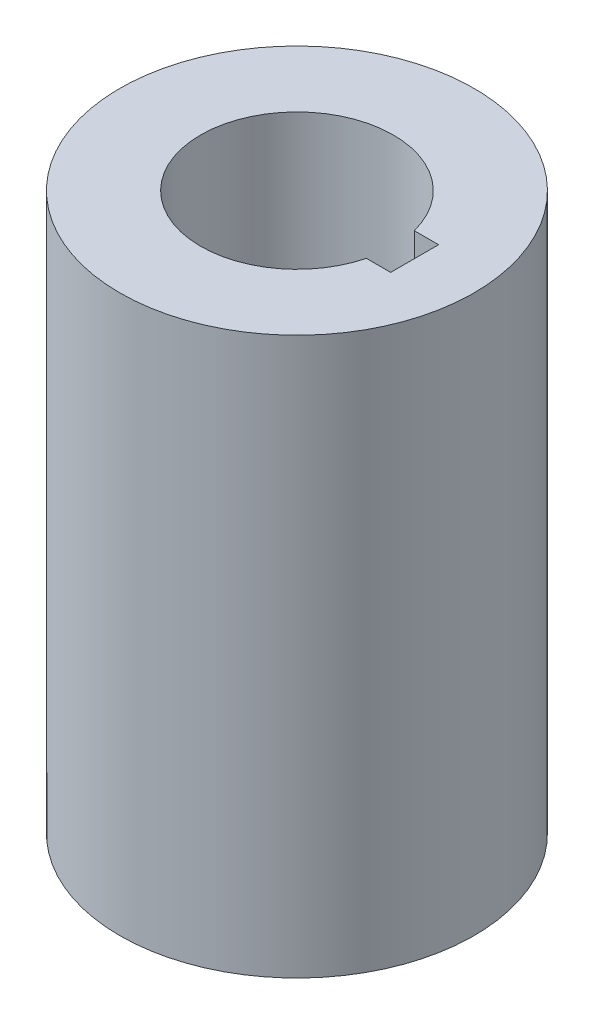
ISO-10303-21;
HEADER;
FILE_DESCRIPTION(('STEP AP214'),'2;1');
FILE_NAME('part.step','',(''),(''),'','','');
FILE_SCHEMA(('AUTOMOTIVE_DESIGN { 1 0 10303 214 1 1 1 1 }'));
ENDSEC;
DATA;
#1=APPLICATION_CONTEXT('core data for automotive mechanical design processes');
#2=APPLICATION_PROTOCOL_DEFINITION('international standard','automotive_design',2000,#1);
#3=PRODUCT_CONTEXT('',#1,'mechanical');
#4=PRODUCT('Part','Part','',(#3));
#5=PRODUCT_RELATED_PRODUCT_CATEGORY('part','',(#4));
#6=PRODUCT_DEFINITION_FORMATION('','',#4);
#7=PRODUCT_DEFINITION_CONTEXT('part definition',#1,'design');
#8=PRODUCT_DEFINITION('design','',#6,#7);
#9=PRODUCT_DEFINITION_SHAPE('','',#8);
#10=(LENGTH_UNIT() NAMED_UNIT(*) SI_UNIT(.MILLI.,.METRE.));
#11=(NAMED_UNIT(*) PLANE_ANGLE_UNIT() SI_UNIT($,.RADIAN.));
#12=(NAMED_UNIT(*) SI_UNIT($,.STERADIAN.) SOLID_ANGLE_UNIT());
#13=UNCERTAINTY_MEASURE_WITH_UNIT(LENGTH_MEASURE(1.E-05),#10,'distance_accuracy_value','');
#14=(GEOMETRIC_REPRESENTATION_CONTEXT(3) GLOBAL_UNCERTAINTY_ASSIGNED_CONTEXT((#13)) GLOBAL_UNIT_ASSIGNED_CONTEXT((#10,
#11,#12)) REPRESENTATION_CONTEXT('',''));
#15=CARTESIAN_POINT('',(0.,0.,0.));
#16=DIRECTION('',(0.,0.,1.));
#17=DIRECTION('',(1.,0.,0.));
#18=AXIS2_PLACEMENT_3D('',#15,#16,#17);
#19=CARTESIAN_POINT('',(0.,55.,0.));
#20=DIRECTION('',(0.,1.,0.));
#21=DIRECTION('',(0.,0.,1.));
#22=AXIS2_PLACEMENT_3D('',#19,#20,#21);
#23=PLANE('',#22);
#24=CARTESIAN_POINT('',(0.,55.,0.));
#25=DIRECTION('',(0.,1.,0.));
#26=DIRECTION('',(0.,0.,1.));
#27=AXIS2_PLACEMENT_3D('',#24,#25,#26);
#28=CIRCLE('',#27,17.5);
#29=CARTESIAN_POINT('',(0.,55.,17.5));
#30=VERTEX_POINT('',#29);
#31=EDGE_CURVE('E11',#30,#30,#28,.T.);
#32=ORIENTED_EDGE('',*,*,#31,.T.);
#33=EDGE_LOOP('',(#32));
#34=FACE_BOUND('',#33,.T.);
#35=DIRECTION('',(0.,0.,-1.));
#36=VECTOR('',#35,1.);
#37=CARTESIAN_POINT('',(11.625,55.,2.36692429520247));
#38=LINE('',#37,#36);
#39=CARTESIAN_POINT('',(11.625,55.,2.36692429520247));
#40=VERTEX_POINT('',#39);
#41=CARTESIAN_POINT('',(11.625,55.,-2.37));
#42=VERTEX_POINT('',#41);
#43=EDGE_CURVE('E107',#40,#42,#38,.T.);
#44=ORIENTED_EDGE('',*,*,#43,.F.);
#45=DIRECTION('',(1.,0.,0.));
#46=VECTOR('',#45,1.);
#47=CARTESIAN_POINT('',(6.895,55.,2.36692429520247));
#48=LINE('',#47,#46);
#49=CARTESIAN_POINT('',(9.22622861091033,55.,2.36692429520247));
#50=VERTEX_POINT('',#49);
#51=EDGE_CURVE('E96',#50,#40,#48,.T.);
#52=ORIENTED_EDGE('',*,*,#51,.F.);
#53=CARTESIAN_POINT('',(0.,55.,0.));
#54=DIRECTION('',(0.,1.,0.));
#55=DIRECTION('',(0.,0.,1.));
#56=AXIS2_PLACEMENT_3D('',#53,#54,#55);
#57=CIRCLE('',#56,9.525);
#58=CARTESIAN_POINT('',(9.225439013944,55.,-2.37));
#59=VERTEX_POINT('',#58);
#60=EDGE_CURVE('E105',#59,#50,#57,.T.);
#61=ORIENTED_EDGE('',*,*,#60,.F.);
#62=DIRECTION('',(-1.,0.,0.));
#63=VECTOR('',#62,1.);
#64=CARTESIAN_POINT('',(9.525,55.,-2.37));
#65=LINE('',#64,#63);
#66=EDGE_CURVE('E116',#42,#59,#65,.T.);
#67=ORIENTED_EDGE('',*,*,#66,.F.);
#68=EDGE_LOOP('',(#44,#52,#61,#67));
#69=FACE_BOUND('',#68,.T.);
#70=ADVANCED_FACE('F44',(#34,#69),#23,.T.);
#71=CARTESIAN_POINT('',(0.,32.,0.));
#72=DIRECTION('',(0.,1.,0.));
#73=DIRECTION('',(0.,0.,1.));
#74=AXIS2_PLACEMENT_3D('',#71,#72,#73);
#75=CYLINDRICAL_SURFACE('',#74,9.525);
#76=DIRECTION('',(0.,1.,0.));
#77=VECTOR('',#76,1.);
#78=CARTESIAN_POINT('',(9.22622861091033,32.,2.36692429520247));
#79=LINE('',#78,#77);
#80=CARTESIAN_POINT('',(9.22622861091033,32.,2.36692429520247));
#81=VERTEX_POINT('',#80);
#82=EDGE_CURVE('E90',#50,#81,#79,.F.);
#83=ORIENTED_EDGE('',*,*,#82,.T.);
#84=CARTESIAN_POINT('',(0.,32.,0.));
#85=DIRECTION('',(0.,1.,0.));
#86=DIRECTION('',(0.,0.,1.));
#87=AXIS2_PLACEMENT_3D('',#84,#85,#86);
#88=CIRCLE('',#87,9.525);
#89=CARTESIAN_POINT('',(9.225439013944,32.,-2.37));
#90=VERTEX_POINT('',#89);
#91=EDGE_CURVE('E103',#90,#81,#88,.T.);
#92=ORIENTED_EDGE('',*,*,#91,.F.);
#93=DIRECTION('',(0.,1.,0.));
#94=VECTOR('',#93,1.);
#95=CARTESIAN_POINT('',(9.225439013944,32.,-2.37));
#96=LINE('',#95,#94);
#97=EDGE_CURVE('E108',#90,#59,#96,.T.);
#98=ORIENTED_EDGE('',*,*,#97,.T.);
#99=ORIENTED_EDGE('',*,*,#60,.T.);
#100=EDGE_LOOP('',(#83,#92,#98,#99));
#101=FACE_BOUND('',#100,.T.);
#102=ADVANCED_FACE('F101',(#101),#75,.F.);
#103=CARTESIAN_POINT('',(0.,55.,0.));
#104=DIRECTION('',(0.,-1.,0.));
#105=DIRECTION('',(0.,0.,-1.));
#106=AXIS2_PLACEMENT_3D('',#103,#104,#105);
#107=CYLINDRICAL_SURFACE('',#106,17.5);
#108=ORIENTED_EDGE('',*,*,#31,.F.);
#109=EDGE_LOOP('',(#108));
#110=FACE_BOUND('',#109,.T.);
#111=CARTESIAN_POINT('',(0.,0.,0.));
#112=DIRECTION('',(0.,1.,0.));
#113=DIRECTION('',(0.,0.,1.));
#114=AXIS2_PLACEMENT_3D('',#111,#112,#113);
#115=CIRCLE('',#114,17.5);
#116=CARTESIAN_POINT('',(0.,0.,17.5));
#117=VERTEX_POINT('',#116);
#118=EDGE_CURVE('E48',#117,#117,#115,.T.);
#119=ORIENTED_EDGE('',*,*,#118,.T.);
#120=EDGE_LOOP('',(#119));
#121=FACE_BOUND('',#120,.T.);
#122=ADVANCED_FACE('F46',(#110,#121),#107,.T.);
#123=CARTESIAN_POINT('',(0.,0.,0.));
#124=DIRECTION('',(0.,1.,0.));
#125=DIRECTION('',(0.,0.,1.));
#126=AXIS2_PLACEMENT_3D('',#123,#124,#125);
#127=PLANE('',#126);
#128=CARTESIAN_POINT('',(0.,0.,0.));
#129=DIRECTION('',(0.,-1.,0.));
#130=DIRECTION('',(0.,0.,-1.));
#131=AXIS2_PLACEMENT_3D('',#128,#129,#130);
#132=CIRCLE('',#131,6.);
#133=CARTESIAN_POINT('',(0.,0.,-6.));
#134=VERTEX_POINT('',#133);
#135=EDGE_CURVE('E136',#134,#134,#132,.T.);
#136=ORIENTED_EDGE('',*,*,#135,.F.);
#137=EDGE_LOOP('',(#136));
#138=FACE_BOUND('',#137,.T.);
#139=ORIENTED_EDGE('',*,*,#118,.F.);
#140=EDGE_LOOP('',(#139));
#141=FACE_BOUND('',#140,.T.);
#142=ADVANCED_FACE('F153',(#138,#141),#127,.F.);
#143=CARTESIAN_POINT('',(0.,32.,0.));
#144=DIRECTION('',(0.,1.,0.));
#145=DIRECTION('',(0.,0.,1.));
#146=AXIS2_PLACEMENT_3D('',#143,#144,#145);
#147=PLANE('',#146);
#148=ORIENTED_EDGE('',*,*,#91,.T.);
#149=DIRECTION('',(1.,0.,0.));
#150=VECTOR('',#149,1.);
#151=CARTESIAN_POINT('',(6.895,32.,2.36692429520247));
#152=LINE('',#151,#150);
#153=CARTESIAN_POINT('',(11.625,32.,2.36692429520247));
#154=VERTEX_POINT('',#153);
#155=EDGE_CURVE('E87',#81,#154,#152,.T.);
#156=ORIENTED_EDGE('',*,*,#155,.T.);
#157=DIRECTION('',(0.,0.,-1.));
#158=VECTOR('',#157,1.);
#159=CARTESIAN_POINT('',(11.625,32.,2.36692429520247));
#160=LINE('',#159,#158);
#161=CARTESIAN_POINT('',(11.625,32.,-2.37));
#162=VERTEX_POINT('',#161);
#163=EDGE_CURVE('E95',#154,#162,#160,.T.);
#164=ORIENTED_EDGE('',*,*,#163,.T.);
#165=DIRECTION('',(-1.,0.,0.));
#166=VECTOR('',#165,1.);
#167=CARTESIAN_POINT('',(9.525,32.,-2.37));
#168=LINE('',#167,#166);
#169=EDGE_CURVE('E60',#162,#90,#168,.T.);
#170=ORIENTED_EDGE('',*,*,#169,.T.);
#171=EDGE_LOOP('',(#148,#156,#164,#170));
#172=FACE_BOUND('',#171,.T.);
#173=ADVANCED_FACE('F110',(#172),#147,.T.);
#174=CARTESIAN_POINT('',(6.895,55.001,2.36692429520247));
#175=DIRECTION('',(0.,0.,-1.));
#176=DIRECTION('',(-1.,0.,0.));
#177=AXIS2_PLACEMENT_3D('',#174,#175,#176);
#178=PLANE('',#177);
#179=ORIENTED_EDGE('',*,*,#51,.T.);
#180=DIRECTION('',(0.,-1.,0.));
#181=VECTOR('',#180,1.);
#182=CARTESIAN_POINT('',(11.625,55.001,2.36692429520247));
#183=LINE('',#182,#181);
#184=EDGE_CURVE('E93',#40,#154,#183,.T.);
#185=ORIENTED_EDGE('',*,*,#184,.T.);
#186=ORIENTED_EDGE('',*,*,#155,.F.);
#187=ORIENTED_EDGE('',*,*,#82,.F.);
#188=EDGE_LOOP('',(#179,#185,#186,#187));
#189=FACE_BOUND('',#188,.T.);
#190=ADVANCED_FACE('F89',(#189),#178,.T.);
#191=CARTESIAN_POINT('',(11.625,55.001,2.36692429520247));
#192=DIRECTION('',(-1.,0.,0.));
#193=DIRECTION('',(0.,0.,1.));
#194=AXIS2_PLACEMENT_3D('',#191,#192,#193);
#195=PLANE('',#194);
#196=ORIENTED_EDGE('',*,*,#43,.T.);
#197=DIRECTION('',(0.,-1.,0.));
#198=VECTOR('',#197,1.);
#199=CARTESIAN_POINT('',(11.625,55.001,-2.37));
#200=LINE('',#199,#198);
#201=EDGE_CURVE('E68',#42,#162,#200,.T.);
#202=ORIENTED_EDGE('',*,*,#201,.T.);
#203=ORIENTED_EDGE('',*,*,#163,.F.);
#204=ORIENTED_EDGE('',*,*,#184,.F.);
#205=EDGE_LOOP('',(#196,#202,#203,#204));
#206=FACE_BOUND('',#205,.T.);
#207=ADVANCED_FACE('F176',(#206),#195,.T.);
#208=CARTESIAN_POINT('',(9.525,55.001,-2.37));
#209=DIRECTION('',(0.,0.,1.));
#210=DIRECTION('',(1.,0.,0.));
#211=AXIS2_PLACEMENT_3D('',#208,#209,#210);
#212=PLANE('',#211);
#213=ORIENTED_EDGE('',*,*,#66,.T.);
#214=ORIENTED_EDGE('',*,*,#97,.F.);
#215=ORIENTED_EDGE('',*,*,#169,.F.);
#216=ORIENTED_EDGE('',*,*,#201,.F.);
#217=EDGE_LOOP('',(#213,#214,#215,#216));
#218=FACE_BOUND('',#217,.T.);
#219=ADVANCED_FACE('F149',(#218),#212,.T.);
#220=CARTESIAN_POINT('',(0.,23.,0.));
#221=DIRECTION('',(0.,-1.,0.));
#222=DIRECTION('',(0.,0.,-1.));
#223=AXIS2_PLACEMENT_3D('',#220,#221,#222);
#224=CYLINDRICAL_SURFACE('',#223,6.);
#225=CARTESIAN_POINT('',(0.,23.,0.));
#226=DIRECTION('',(0.,-1.,0.));
#227=DIRECTION('',(0.,0.,-1.));
#228=AXIS2_PLACEMENT_3D('',#225,#226,#227);
#229=CIRCLE('',#228,6.);
#230=CARTESIAN_POINT('',(0.,23.,-6.));
#231=VERTEX_POINT('',#230);
#232=EDGE_CURVE('E135',#231,#231,#229,.T.);
#233=ORIENTED_EDGE('',*,*,#232,.F.);
#234=EDGE_LOOP('',(#233));
#235=FACE_BOUND('',#234,.T.);
#236=ORIENTED_EDGE('',*,*,#135,.T.);
#237=EDGE_LOOP('',(#236));
#238=FACE_BOUND('',#237,.T.);
#239=ADVANCED_FACE('F146',(#235,#238),#224,.F.);
#240=CARTESIAN_POINT('',(0.,23.,0.));
#241=DIRECTION('',(0.,-1.,0.));
#242=DIRECTION('',(0.,0.,-1.));
#243=AXIS2_PLACEMENT_3D('',#240,#241,#242);
#244=PLANE('',#243);
#245=ORIENTED_EDGE('',*,*,#232,.T.);
#246=EDGE_LOOP('',(#245));
#247=FACE_BOUND('',#246,.T.);
#248=ADVANCED_FACE('F144',(#247),#244,.T.);
#249=CLOSED_SHELL('',(#70,#102,#122,#142,#173,#190,#207,#219,#239,#248));
#250=MANIFOLD_SOLID_BREP('B2',#249);
#251=ADVANCED_BREP_SHAPE_REPRESENTATION('',(#18,#250),#14);
#252=SHAPE_DEFINITION_REPRESENTATION(#9,#251);
ENDSEC;
END-ISO-10303-21;
